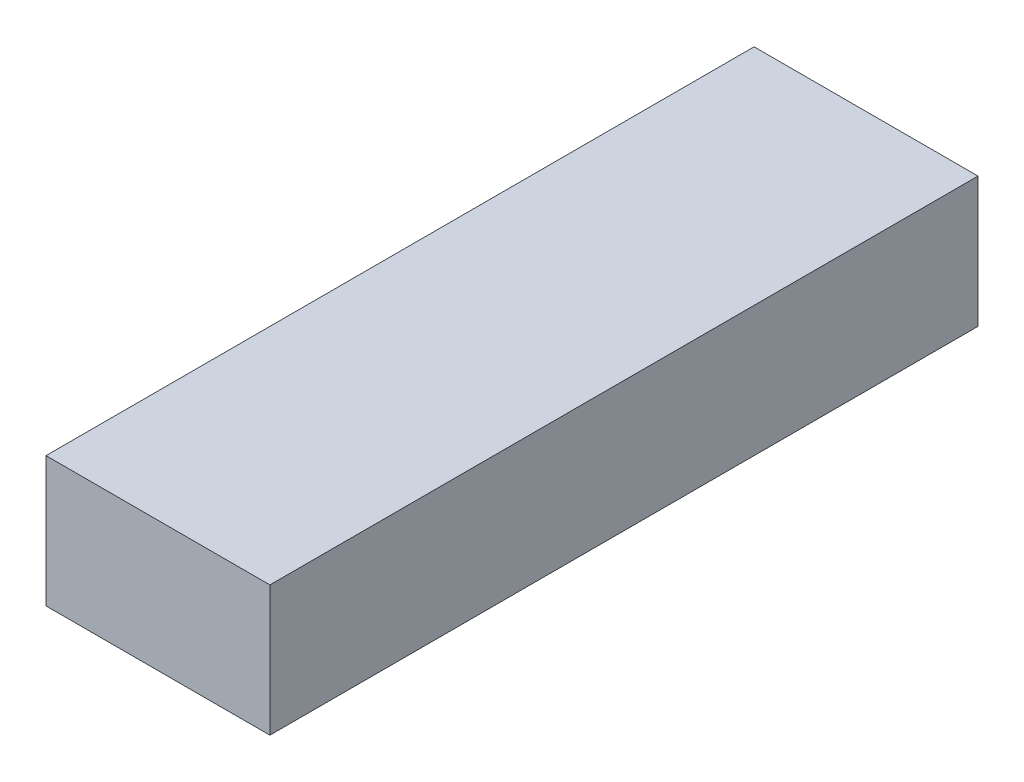
ISO-10303-21;
HEADER;
FILE_DESCRIPTION(('STEP AP214'),'2;1');
FILE_NAME('part.step','',(''),(''),'','','');
FILE_SCHEMA(('AUTOMOTIVE_DESIGN { 1 0 10303 214 1 1 1 1 }'));
ENDSEC;
DATA;
#1=APPLICATION_CONTEXT('core data for automotive mechanical design processes');
#2=APPLICATION_PROTOCOL_DEFINITION('international standard','automotive_design',2000,#1);
#3=PRODUCT_CONTEXT('',#1,'mechanical');
#4=PRODUCT('Part','Part','',(#3));
#5=PRODUCT_RELATED_PRODUCT_CATEGORY('part','',(#4));
#6=PRODUCT_DEFINITION_FORMATION('','',#4);
#7=PRODUCT_DEFINITION_CONTEXT('part definition',#1,'design');
#8=PRODUCT_DEFINITION('design','',#6,#7);
#9=PRODUCT_DEFINITION_SHAPE('','',#8);
#10=(LENGTH_UNIT() NAMED_UNIT(*) SI_UNIT(.MILLI.,.METRE.));
#11=(NAMED_UNIT(*) PLANE_ANGLE_UNIT() SI_UNIT($,.RADIAN.));
#12=(NAMED_UNIT(*) SI_UNIT($,.STERADIAN.) SOLID_ANGLE_UNIT());
#13=UNCERTAINTY_MEASURE_WITH_UNIT(LENGTH_MEASURE(1.E-05),#10,'distance_accuracy_value','');
#14=(GEOMETRIC_REPRESENTATION_CONTEXT(3) GLOBAL_UNCERTAINTY_ASSIGNED_CONTEXT((#13)) GLOBAL_UNIT_ASSIGNED_CONTEXT((#10,
#11,#12)) REPRESENTATION_CONTEXT('',''));
#15=CARTESIAN_POINT('',(0.,0.,0.));
#16=DIRECTION('',(0.,0.,1.));
#17=DIRECTION('',(1.,0.,0.));
#18=AXIS2_PLACEMENT_3D('',#15,#16,#17);
#19=CARTESIAN_POINT('',(0.,25.,0.));
#20=DIRECTION('',(1.,0.,0.));
#21=DIRECTION('',(0.,0.,-1.));
#22=AXIS2_PLACEMENT_3D('',#19,#20,#21);
#23=PLANE('',#22);
#24=DIRECTION('',(0.,0.,1.));
#25=VECTOR('',#24,1.);
#26=CARTESIAN_POINT('',(0.,0.,0.));
#27=LINE('',#26,#25);
#28=CARTESIAN_POINT('',(0.,0.,-136.));
#29=VERTEX_POINT('',#28);
#30=CARTESIAN_POINT('',(0.,0.,0.));
#31=VERTEX_POINT('',#30);
#32=EDGE_CURVE('E101',#29,#31,#27,.T.);
#33=ORIENTED_EDGE('',*,*,#32,.T.);
#34=DIRECTION('',(0.,-1.,0.));
#35=VECTOR('',#34,1.);
#36=CARTESIAN_POINT('',(0.,25.,0.));
#37=LINE('',#36,#35);
#38=CARTESIAN_POINT('',(0.,25.,0.));
#39=VERTEX_POINT('',#38);
#40=EDGE_CURVE('E11',#39,#31,#37,.T.);
#41=ORIENTED_EDGE('',*,*,#40,.F.);
#42=DIRECTION('',(0.,0.,1.));
#43=VECTOR('',#42,1.);
#44=CARTESIAN_POINT('',(0.,25.,0.));
#45=LINE('',#44,#43);
#46=CARTESIAN_POINT('',(0.,25.,-136.));
#47=VERTEX_POINT('',#46);
#48=EDGE_CURVE('E89',#47,#39,#45,.T.);
#49=ORIENTED_EDGE('',*,*,#48,.F.);
#50=DIRECTION('',(0.,-1.,0.));
#51=VECTOR('',#50,1.);
#52=CARTESIAN_POINT('',(0.,25.,-136.));
#53=LINE('',#52,#51);
#54=EDGE_CURVE('E97',#47,#29,#53,.T.);
#55=ORIENTED_EDGE('',*,*,#54,.T.);
#56=EDGE_LOOP('',(#33,#41,#49,#55));
#57=FACE_BOUND('',#56,.T.);
#58=ADVANCED_FACE('F38',(#57),#23,.F.);
#59=CARTESIAN_POINT('',(0.,25.,0.));
#60=DIRECTION('',(0.,0.,-1.));
#61=DIRECTION('',(-1.,0.,0.));
#62=AXIS2_PLACEMENT_3D('',#59,#60,#61);
#63=PLANE('',#62);
#64=DIRECTION('',(1.,0.,0.));
#65=VECTOR('',#64,1.);
#66=CARTESIAN_POINT('',(0.,0.,0.));
#67=LINE('',#66,#65);
#68=CARTESIAN_POINT('',(43.,0.,0.));
#69=VERTEX_POINT('',#68);
#70=EDGE_CURVE('E93',#31,#69,#67,.T.);
#71=ORIENTED_EDGE('',*,*,#70,.T.);
#72=DIRECTION('',(0.,-1.,0.));
#73=VECTOR('',#72,1.);
#74=CARTESIAN_POINT('',(43.,25.,0.));
#75=LINE('',#74,#73);
#76=CARTESIAN_POINT('',(43.,25.,0.));
#77=VERTEX_POINT('',#76);
#78=EDGE_CURVE('E46',#77,#69,#75,.T.);
#79=ORIENTED_EDGE('',*,*,#78,.F.);
#80=DIRECTION('',(1.,0.,0.));
#81=VECTOR('',#80,1.);
#82=CARTESIAN_POINT('',(0.,25.,0.));
#83=LINE('',#82,#81);
#84=EDGE_CURVE('E84',#39,#77,#83,.T.);
#85=ORIENTED_EDGE('',*,*,#84,.F.);
#86=ORIENTED_EDGE('',*,*,#40,.T.);
#87=EDGE_LOOP('',(#71,#79,#85,#86));
#88=FACE_BOUND('',#87,.T.);
#89=ADVANCED_FACE('F92',(#88),#63,.F.);
#90=CARTESIAN_POINT('',(43.,25.,0.));
#91=DIRECTION('',(-1.,0.,0.));
#92=DIRECTION('',(0.,0.,1.));
#93=AXIS2_PLACEMENT_3D('',#90,#91,#92);
#94=PLANE('',#93);
#95=DIRECTION('',(0.,0.,-1.));
#96=VECTOR('',#95,1.);
#97=CARTESIAN_POINT('',(43.,0.,0.));
#98=LINE('',#97,#96);
#99=CARTESIAN_POINT('',(43.,0.,-136.));
#100=VERTEX_POINT('',#99);
#101=EDGE_CURVE('E71',#69,#100,#98,.T.);
#102=ORIENTED_EDGE('',*,*,#101,.T.);
#103=DIRECTION('',(0.,-1.,0.));
#104=VECTOR('',#103,1.);
#105=CARTESIAN_POINT('',(43.,25.,-136.));
#106=LINE('',#105,#104);
#107=CARTESIAN_POINT('',(43.,25.,-136.));
#108=VERTEX_POINT('',#107);
#109=EDGE_CURVE('E94',#108,#100,#106,.T.);
#110=ORIENTED_EDGE('',*,*,#109,.F.);
#111=DIRECTION('',(0.,0.,-1.));
#112=VECTOR('',#111,1.);
#113=CARTESIAN_POINT('',(43.,25.,0.));
#114=LINE('',#113,#112);
#115=EDGE_CURVE('E87',#77,#108,#114,.T.);
#116=ORIENTED_EDGE('',*,*,#115,.F.);
#117=ORIENTED_EDGE('',*,*,#78,.T.);
#118=EDGE_LOOP('',(#102,#110,#116,#117));
#119=FACE_BOUND('',#118,.T.);
#120=ADVANCED_FACE('F95',(#119),#94,.F.);
#121=CARTESIAN_POINT('',(0.,25.,-136.));
#122=DIRECTION('',(0.,0.,1.));
#123=DIRECTION('',(1.,0.,0.));
#124=AXIS2_PLACEMENT_3D('',#121,#122,#123);
#125=PLANE('',#124);
#126=DIRECTION('',(-1.,0.,0.));
#127=VECTOR('',#126,1.);
#128=CARTESIAN_POINT('',(0.,0.,-136.));
#129=LINE('',#128,#127);
#130=EDGE_CURVE('E77',#100,#29,#129,.T.);
#131=ORIENTED_EDGE('',*,*,#130,.T.);
#132=ORIENTED_EDGE('',*,*,#54,.F.);
#133=DIRECTION('',(-1.,0.,0.));
#134=VECTOR('',#133,1.);
#135=CARTESIAN_POINT('',(0.,25.,-136.));
#136=LINE('',#135,#134);
#137=EDGE_CURVE('E54',#108,#47,#136,.T.);
#138=ORIENTED_EDGE('',*,*,#137,.F.);
#139=ORIENTED_EDGE('',*,*,#109,.T.);
#140=EDGE_LOOP('',(#131,#132,#138,#139));
#141=FACE_BOUND('',#140,.T.);
#142=ADVANCED_FACE('F108',(#141),#125,.F.);
#143=CARTESIAN_POINT('',(0.,25.,0.));
#144=DIRECTION('',(0.,-1.,0.));
#145=DIRECTION('',(0.,0.,-1.));
#146=AXIS2_PLACEMENT_3D('',#143,#144,#145);
#147=PLANE('',#146);
#148=ORIENTED_EDGE('',*,*,#48,.T.);
#149=ORIENTED_EDGE('',*,*,#84,.T.);
#150=ORIENTED_EDGE('',*,*,#115,.T.);
#151=ORIENTED_EDGE('',*,*,#137,.T.);
#152=EDGE_LOOP('',(#148,#149,#150,#151));
#153=FACE_BOUND('',#152,.T.);
#154=ADVANCED_FACE('F85',(#153),#147,.F.);
#155=CARTESIAN_POINT('',(0.,0.,0.));
#156=DIRECTION('',(0.,-1.,0.));
#157=DIRECTION('',(0.,0.,-1.));
#158=AXIS2_PLACEMENT_3D('',#155,#156,#157);
#159=PLANE('',#158);
#160=ORIENTED_EDGE('',*,*,#32,.F.);
#161=ORIENTED_EDGE('',*,*,#130,.F.);
#162=ORIENTED_EDGE('',*,*,#101,.F.);
#163=ORIENTED_EDGE('',*,*,#70,.F.);
#164=EDGE_LOOP('',(#160,#161,#162,#163));
#165=FACE_BOUND('',#164,.T.);
#166=ADVANCED_FACE('F111',(#165),#159,.T.);
#167=CLOSED_SHELL('',(#58,#89,#120,#142,#154,#166));
#168=MANIFOLD_SOLID_BREP('B2',#167);
#169=ADVANCED_BREP_SHAPE_REPRESENTATION('',(#18,#168),#14);
#170=SHAPE_DEFINITION_REPRESENTATION(#9,#169);
ENDSEC;
END-ISO-10303-21;
